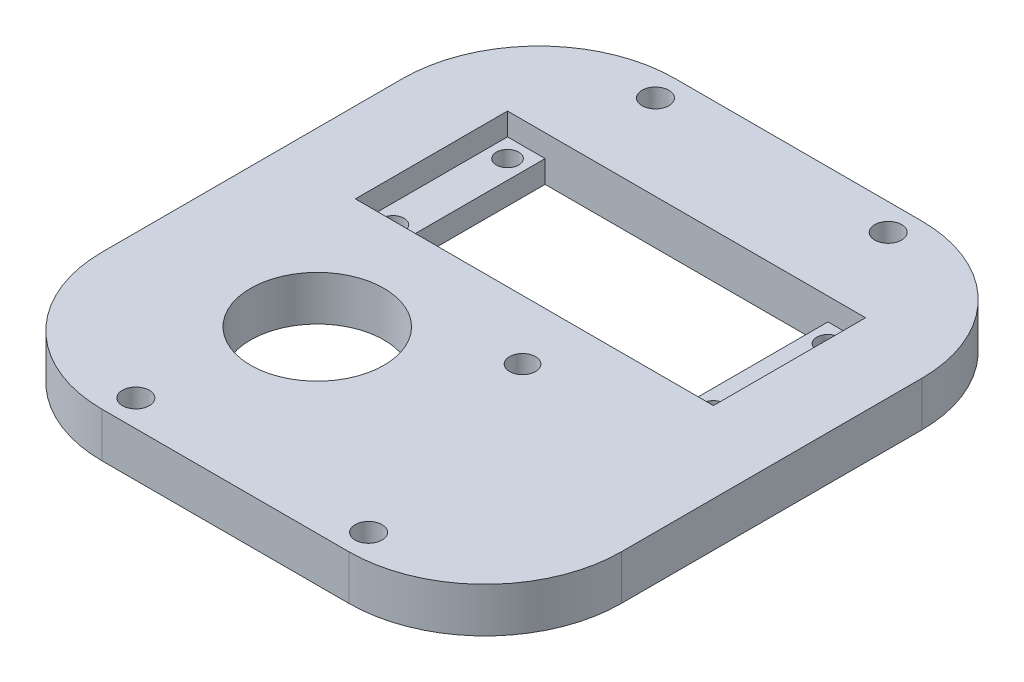
ISO-10303-21;
HEADER;
FILE_DESCRIPTION(('STEP AP214'),'2;1');
FILE_NAME('part.step','',(''),(''),'','','');
FILE_SCHEMA(('AUTOMOTIVE_DESIGN { 1 0 10303 214 1 1 1 1 }'));
ENDSEC;
DATA;
#1=APPLICATION_CONTEXT('core data for automotive mechanical design processes');
#2=APPLICATION_PROTOCOL_DEFINITION('international standard','automotive_design',2000,#1);
#3=PRODUCT_CONTEXT('',#1,'mechanical');
#4=PRODUCT('Part','Part','',(#3));
#5=PRODUCT_RELATED_PRODUCT_CATEGORY('part','',(#4));
#6=PRODUCT_DEFINITION_FORMATION('','',#4);
#7=PRODUCT_DEFINITION_CONTEXT('part definition',#1,'design');
#8=PRODUCT_DEFINITION('design','',#6,#7);
#9=PRODUCT_DEFINITION_SHAPE('','',#8);
#10=(LENGTH_UNIT() NAMED_UNIT(*) SI_UNIT(.MILLI.,.METRE.));
#11=(NAMED_UNIT(*) PLANE_ANGLE_UNIT() SI_UNIT($,.RADIAN.));
#12=(NAMED_UNIT(*) SI_UNIT($,.STERADIAN.) SOLID_ANGLE_UNIT());
#13=UNCERTAINTY_MEASURE_WITH_UNIT(LENGTH_MEASURE(1.E-05),#10,'distance_accuracy_value','');
#14=(GEOMETRIC_REPRESENTATION_CONTEXT(3) GLOBAL_UNCERTAINTY_ASSIGNED_CONTEXT((#13)) GLOBAL_UNIT_ASSIGNED_CONTEXT((#10,
#11,#12)) REPRESENTATION_CONTEXT('',''));
#15=CARTESIAN_POINT('',(0.,0.,0.));
#16=DIRECTION('',(0.,0.,1.));
#17=DIRECTION('',(1.,0.,0.));
#18=AXIS2_PLACEMENT_3D('',#15,#16,#17);
#19=CARTESIAN_POINT('',(0.,5.,0.));
#20=DIRECTION('',(0.,1.,0.));
#21=DIRECTION('',(0.,0.,1.));
#22=AXIS2_PLACEMENT_3D('',#19,#20,#21);
#23=PLANE('',#22);
#24=CARTESIAN_POINT('',(5.32323014813003,5.,16.1450680020259));
#25=DIRECTION('',(0.,1.,0.));
#26=DIRECTION('',(0.,0.,1.));
#27=AXIS2_PLACEMENT_3D('',#24,#25,#26);
#28=CIRCLE('',#27,1.45);
#29=CARTESIAN_POINT('',(5.32323014813003,5.,17.5950680020259));
#30=VERTEX_POINT('',#29);
#31=EDGE_CURVE('E239',#30,#30,#28,.T.);
#32=ORIENTED_EDGE('',*,*,#31,.F.);
#33=EDGE_LOOP('',(#32));
#34=FACE_BOUND('',#33,.T.);
#35=DIRECTION('',(1.,0.,0.));
#36=VECTOR('',#35,1.);
#37=CARTESIAN_POINT('',(0.,5.,44.));
#38=LINE('',#37,#36);
#39=CARTESIAN_POINT('',(-13.7775152864747,5.,44.));
#40=VERTEX_POINT('',#39);
#41=CARTESIAN_POINT('',(13.7775152864747,5.,44.));
#42=VERTEX_POINT('',#41);
#43=EDGE_CURVE('E217',#40,#42,#38,.T.);
#44=ORIENTED_EDGE('',*,*,#43,.T.);
#45=CARTESIAN_POINT('',(13.7775152864747,5.,28.7775152864747));
#46=DIRECTION('',(0.,1.,0.));
#47=DIRECTION('',(0.,0.,1.));
#48=AXIS2_PLACEMENT_3D('',#45,#46,#47);
#49=CIRCLE('',#48,15.2224847135253);
#50=CARTESIAN_POINT('',(29.,5.,28.7775152864747));
#51=VERTEX_POINT('',#50);
#52=EDGE_CURVE('E220',#42,#51,#49,.T.);
#53=ORIENTED_EDGE('',*,*,#52,.T.);
#54=DIRECTION('',(0.,0.,-1.));
#55=VECTOR('',#54,1.);
#56=CARTESIAN_POINT('',(29.,5.,0.));
#57=LINE('',#56,#55);
#58=CARTESIAN_POINT('',(29.,5.,-4.77751528647466));
#59=VERTEX_POINT('',#58);
#60=EDGE_CURVE('E223',#51,#59,#57,.T.);
#61=ORIENTED_EDGE('',*,*,#60,.T.);
#62=CARTESIAN_POINT('',(13.7775152864747,5.,-4.77751528647466));
#63=DIRECTION('',(0.,1.,0.));
#64=DIRECTION('',(0.,0.,1.));
#65=AXIS2_PLACEMENT_3D('',#62,#63,#64);
#66=CIRCLE('',#65,15.2224847135253);
#67=CARTESIAN_POINT('',(13.7775152864747,5.,-20.));
#68=VERTEX_POINT('',#67);
#69=EDGE_CURVE('E225',#68,#59,#66,.F.);
#70=ORIENTED_EDGE('',*,*,#69,.F.);
#71=DIRECTION('',(1.,0.,0.));
#72=VECTOR('',#71,1.);
#73=CARTESIAN_POINT('',(0.,5.,-20.));
#74=LINE('',#73,#72);
#75=CARTESIAN_POINT('',(-13.7775152864747,5.,-20.));
#76=VERTEX_POINT('',#75);
#77=EDGE_CURVE('E228',#76,#68,#74,.T.);
#78=ORIENTED_EDGE('',*,*,#77,.F.);
#79=CARTESIAN_POINT('',(-13.7775152864747,5.,-4.77751528647466));
#80=DIRECTION('',(0.,1.,0.));
#81=DIRECTION('',(0.,0.,1.));
#82=AXIS2_PLACEMENT_3D('',#79,#80,#81);
#83=CIRCLE('',#82,15.2224847135253);
#84=CARTESIAN_POINT('',(-29.,5.,-4.77751528647466));
#85=VERTEX_POINT('',#84);
#86=EDGE_CURVE('E231',#85,#76,#83,.F.);
#87=ORIENTED_EDGE('',*,*,#86,.F.);
#88=DIRECTION('',(0.,0.,-1.));
#89=VECTOR('',#88,1.);
#90=CARTESIAN_POINT('',(-29.,5.,0.));
#91=LINE('',#90,#89);
#92=CARTESIAN_POINT('',(-29.,5.,28.7775152864747));
#93=VERTEX_POINT('',#92);
#94=EDGE_CURVE('E234',#93,#85,#91,.T.);
#95=ORIENTED_EDGE('',*,*,#94,.F.);
#96=CARTESIAN_POINT('',(-13.7775152864747,5.,28.7775152864747));
#97=DIRECTION('',(0.,1.,0.));
#98=DIRECTION('',(0.,0.,1.));
#99=AXIS2_PLACEMENT_3D('',#96,#97,#98);
#100=CIRCLE('',#99,15.2224847135253);
#101=EDGE_CURVE('E237',#93,#40,#100,.T.);
#102=ORIENTED_EDGE('',*,*,#101,.T.);
#103=EDGE_LOOP('',(#44,#53,#61,#70,#78,#87,#95,#102));
#104=FACE_BOUND('',#103,.T.);
#105=CARTESIAN_POINT('',(13.,5.,-17.0248169859408));
#106=DIRECTION('',(0.,1.,0.));
#107=DIRECTION('',(0.,0.,1.));
#108=AXIS2_PLACEMENT_3D('',#105,#106,#107);
#109=CIRCLE('',#108,1.5);
#110=CARTESIAN_POINT('',(13.,5.,-15.5248169859408));
#111=VERTEX_POINT('',#110);
#112=EDGE_CURVE('E200',#111,#111,#109,.T.);
#113=ORIENTED_EDGE('',*,*,#112,.F.);
#114=EDGE_LOOP('',(#113));
#115=FACE_BOUND('',#114,.T.);
#116=CARTESIAN_POINT('',(-13.,5.,-17.0248169859408));
#117=DIRECTION('',(0.,1.,0.));
#118=DIRECTION('',(0.,0.,1.));
#119=AXIS2_PLACEMENT_3D('',#116,#117,#118);
#120=CIRCLE('',#119,1.5);
#121=CARTESIAN_POINT('',(-13.,5.,-15.5248169859408));
#122=VERTEX_POINT('',#121);
#123=EDGE_CURVE('E193',#122,#122,#120,.T.);
#124=ORIENTED_EDGE('',*,*,#123,.F.);
#125=EDGE_LOOP('',(#124));
#126=FACE_BOUND('',#125,.T.);
#127=CARTESIAN_POINT('',(-13.,5.,41.0248169859408));
#128=DIRECTION('',(0.,1.,0.));
#129=DIRECTION('',(0.,0.,-1.));
#130=AXIS2_PLACEMENT_3D('',#127,#128,#129);
#131=CIRCLE('',#130,1.5);
#132=CARTESIAN_POINT('',(-13.,5.,39.5248169859408));
#133=VERTEX_POINT('',#132);
#134=EDGE_CURVE('E201',#133,#133,#131,.T.);
#135=ORIENTED_EDGE('',*,*,#134,.F.);
#136=EDGE_LOOP('',(#135));
#137=FACE_BOUND('',#136,.T.);
#138=CARTESIAN_POINT('',(13.,5.,41.0248169859408));
#139=DIRECTION('',(0.,1.,0.));
#140=DIRECTION('',(0.,0.,-1.));
#141=AXIS2_PLACEMENT_3D('',#138,#139,#140);
#142=CIRCLE('',#141,1.5);
#143=CARTESIAN_POINT('',(13.,5.,39.5248169859408));
#144=VERTEX_POINT('',#143);
#145=EDGE_CURVE('E192',#144,#144,#142,.T.);
#146=ORIENTED_EDGE('',*,*,#145,.F.);
#147=EDGE_LOOP('',(#146));
#148=FACE_BOUND('',#147,.T.);
#149=CARTESIAN_POINT('',(-9.75324302390866,5.,24.));
#150=DIRECTION('',(0.,1.,0.));
#151=DIRECTION('',(0.,0.,1.));
#152=AXIS2_PLACEMENT_3D('',#149,#150,#151);
#153=CIRCLE('',#152,7.45);
#154=CARTESIAN_POINT('',(-9.75324302390866,5.,31.45));
#155=VERTEX_POINT('',#154);
#156=EDGE_CURVE('E188',#155,#155,#153,.T.);
#157=ORIENTED_EDGE('',*,*,#156,.F.);
#158=EDGE_LOOP('',(#157));
#159=FACE_BOUND('',#158,.T.);
#160=DIRECTION('',(0.,0.,-1.));
#161=VECTOR('',#160,1.);
#162=CARTESIAN_POINT('',(-20.,5.,0.));
#163=LINE('',#162,#161);
#164=CARTESIAN_POINT('',(-20.,5.,9.5));
#165=VERTEX_POINT('',#164);
#166=CARTESIAN_POINT('',(-20.,5.,-7.5));
#167=VERTEX_POINT('',#166);
#168=EDGE_CURVE('E161',#165,#167,#163,.T.);
#169=ORIENTED_EDGE('',*,*,#168,.T.);
#170=DIRECTION('',(1.,0.,0.));
#171=VECTOR('',#170,1.);
#172=CARTESIAN_POINT('',(0.,5.,-7.5));
#173=LINE('',#172,#171);
#174=CARTESIAN_POINT('',(20.,5.,-7.5));
#175=VERTEX_POINT('',#174);
#176=EDGE_CURVE('E641',#167,#175,#173,.T.);
#177=ORIENTED_EDGE('',*,*,#176,.T.);
#178=DIRECTION('',(0.,0.,-1.));
#179=VECTOR('',#178,1.);
#180=CARTESIAN_POINT('',(20.,5.,0.));
#181=LINE('',#180,#179);
#182=CARTESIAN_POINT('',(20.,5.,9.5));
#183=VERTEX_POINT('',#182);
#184=EDGE_CURVE('E628',#183,#175,#181,.T.);
#185=ORIENTED_EDGE('',*,*,#184,.F.);
#186=DIRECTION('',(1.,0.,0.));
#187=VECTOR('',#186,1.);
#188=CARTESIAN_POINT('',(0.,5.,9.5));
#189=LINE('',#188,#187);
#190=EDGE_CURVE('E179',#165,#183,#189,.T.);
#191=ORIENTED_EDGE('',*,*,#190,.F.);
#192=EDGE_LOOP('',(#169,#177,#185,#191));
#193=FACE_BOUND('',#192,.T.);
#194=ADVANCED_FACE('F36',(#34,#104,#115,#126,#137,#148,#159,#193),#23,.T.);
#195=CARTESIAN_POINT('',(-15.8,-35.8825863058949,0.));
#196=DIRECTION('',(1.,0.,0.));
#197=DIRECTION('',(0.,0.,-1.));
#198=AXIS2_PLACEMENT_3D('',#195,#196,#197);
#199=PLANE('',#198);
#200=DIRECTION('',(0.,1.,0.));
#201=VECTOR('',#200,1.);
#202=CARTESIAN_POINT('',(-15.8,-35.8825863058949,-7.5));
#203=LINE('',#202,#201);
#204=CARTESIAN_POINT('',(-15.8,0.,-7.5));
#205=VERTEX_POINT('',#204);
#206=CARTESIAN_POINT('',(-15.8,2.5,-7.5));
#207=VERTEX_POINT('',#206);
#208=EDGE_CURVE('E155',#205,#207,#203,.T.);
#209=ORIENTED_EDGE('',*,*,#208,.T.);
#210=DIRECTION('',(0.,0.,1.));
#211=VECTOR('',#210,1.);
#212=CARTESIAN_POINT('',(-15.8,2.5,0.));
#213=LINE('',#212,#211);
#214=CARTESIAN_POINT('',(-15.8,2.5,9.5));
#215=VERTEX_POINT('',#214);
#216=EDGE_CURVE('E164',#207,#215,#213,.T.);
#217=ORIENTED_EDGE('',*,*,#216,.T.);
#218=DIRECTION('',(0.,1.,0.));
#219=VECTOR('',#218,1.);
#220=CARTESIAN_POINT('',(-15.8,-35.8825863058949,9.5));
#221=LINE('',#220,#219);
#222=CARTESIAN_POINT('',(-15.8,0.,9.5));
#223=VERTEX_POINT('',#222);
#224=EDGE_CURVE('E175',#223,#215,#221,.T.);
#225=ORIENTED_EDGE('',*,*,#224,.F.);
#226=DIRECTION('',(0.,0.,1.));
#227=VECTOR('',#226,1.);
#228=CARTESIAN_POINT('',(-15.8,0.,0.));
#229=LINE('',#228,#227);
#230=EDGE_CURVE('E174',#205,#223,#229,.T.);
#231=ORIENTED_EDGE('',*,*,#230,.F.);
#232=EDGE_LOOP('',(#209,#217,#225,#231));
#233=FACE_BOUND('',#232,.T.);
#234=ADVANCED_FACE('F172',(#233),#199,.T.);
#235=CARTESIAN_POINT('',(15.8,-35.8825863058949,0.));
#236=DIRECTION('',(-1.,0.,0.));
#237=DIRECTION('',(0.,0.,1.));
#238=AXIS2_PLACEMENT_3D('',#235,#236,#237);
#239=PLANE('',#238);
#240=DIRECTION('',(0.,1.,0.));
#241=VECTOR('',#240,1.);
#242=CARTESIAN_POINT('',(15.8,-35.8825863058949,9.5));
#243=LINE('',#242,#241);
#244=CARTESIAN_POINT('',(15.8,0.,9.5));
#245=VERTEX_POINT('',#244);
#246=CARTESIAN_POINT('',(15.8,2.5,9.5));
#247=VERTEX_POINT('',#246);
#248=EDGE_CURVE('E177',#245,#247,#243,.T.);
#249=ORIENTED_EDGE('',*,*,#248,.T.);
#250=DIRECTION('',(0.,0.,1.));
#251=VECTOR('',#250,1.);
#252=CARTESIAN_POINT('',(15.8,2.5,0.));
#253=LINE('',#252,#251);
#254=CARTESIAN_POINT('',(15.8,2.5,-7.5));
#255=VERTEX_POINT('',#254);
#256=EDGE_CURVE('E620',#255,#247,#253,.T.);
#257=ORIENTED_EDGE('',*,*,#256,.F.);
#258=DIRECTION('',(0.,1.,0.));
#259=VECTOR('',#258,1.);
#260=CARTESIAN_POINT('',(15.8,-35.8825863058949,-7.5));
#261=LINE('',#260,#259);
#262=CARTESIAN_POINT('',(15.8,0.,-7.5));
#263=VERTEX_POINT('',#262);
#264=EDGE_CURVE('E58',#263,#255,#261,.T.);
#265=ORIENTED_EDGE('',*,*,#264,.F.);
#266=DIRECTION('',(0.,0.,-1.));
#267=VECTOR('',#266,1.);
#268=CARTESIAN_POINT('',(15.8,0.,0.));
#269=LINE('',#268,#267);
#270=EDGE_CURVE('E189',#245,#263,#269,.T.);
#271=ORIENTED_EDGE('',*,*,#270,.F.);
#272=EDGE_LOOP('',(#249,#257,#265,#271));
#273=FACE_BOUND('',#272,.T.);
#274=ADVANCED_FACE('F328',(#273),#239,.T.);
#275=CARTESIAN_POINT('',(17.9,-35.8825863058949,-5.4));
#276=DIRECTION('',(0.,1.,0.));
#277=DIRECTION('',(0.,0.,1.));
#278=AXIS2_PLACEMENT_3D('',#275,#276,#277);
#279=CYLINDRICAL_SURFACE('',#278,1.25);
#280=CARTESIAN_POINT('',(17.9,0.,-5.4));
#281=DIRECTION('',(0.,1.,0.));
#282=DIRECTION('',(0.,0.,1.));
#283=AXIS2_PLACEMENT_3D('',#280,#281,#282);
#284=CIRCLE('',#283,1.25);
#285=CARTESIAN_POINT('',(17.9,0.,-4.15));
#286=VERTEX_POINT('',#285);
#287=EDGE_CURVE('E638',#286,#286,#284,.T.);
#288=ORIENTED_EDGE('',*,*,#287,.F.);
#289=EDGE_LOOP('',(#288));
#290=FACE_BOUND('',#289,.T.);
#291=CARTESIAN_POINT('',(17.9,2.5,-5.4));
#292=DIRECTION('',(0.,1.,0.));
#293=DIRECTION('',(0.,0.,1.));
#294=AXIS2_PLACEMENT_3D('',#291,#292,#293);
#295=CIRCLE('',#294,1.25);
#296=CARTESIAN_POINT('',(17.9,2.5,-4.15));
#297=VERTEX_POINT('',#296);
#298=EDGE_CURVE('E619',#297,#297,#295,.T.);
#299=ORIENTED_EDGE('',*,*,#298,.T.);
#300=EDGE_LOOP('',(#299));
#301=FACE_BOUND('',#300,.T.);
#302=ADVANCED_FACE('F509',(#290,#301),#279,.F.);
#303=CARTESIAN_POINT('',(17.9,-35.8825863058949,7.4));
#304=DIRECTION('',(0.,1.,0.));
#305=DIRECTION('',(0.,0.,1.));
#306=AXIS2_PLACEMENT_3D('',#303,#304,#305);
#307=CYLINDRICAL_SURFACE('',#306,1.25);
#308=CARTESIAN_POINT('',(17.9,0.,7.4));
#309=DIRECTION('',(0.,1.,0.));
#310=DIRECTION('',(0.,0.,1.));
#311=AXIS2_PLACEMENT_3D('',#308,#309,#310);
#312=CIRCLE('',#311,1.25);
#313=CARTESIAN_POINT('',(17.9,0.,8.65));
#314=VERTEX_POINT('',#313);
#315=EDGE_CURVE('E642',#314,#314,#312,.F.);
#316=ORIENTED_EDGE('',*,*,#315,.T.);
#317=EDGE_LOOP('',(#316));
#318=FACE_BOUND('',#317,.T.);
#319=CARTESIAN_POINT('',(17.9,2.5,7.4));
#320=DIRECTION('',(0.,1.,0.));
#321=DIRECTION('',(0.,0.,1.));
#322=AXIS2_PLACEMENT_3D('',#319,#320,#321);
#323=CIRCLE('',#322,1.25);
#324=CARTESIAN_POINT('',(17.9,2.5,8.65));
#325=VERTEX_POINT('',#324);
#326=EDGE_CURVE('E614',#325,#325,#323,.F.);
#327=ORIENTED_EDGE('',*,*,#326,.F.);
#328=EDGE_LOOP('',(#327));
#329=FACE_BOUND('',#328,.T.);
#330=ADVANCED_FACE('F520',(#318,#329),#307,.F.);
#331=CARTESIAN_POINT('',(-17.9,-35.8825863058949,7.4));
#332=DIRECTION('',(0.,1.,0.));
#333=DIRECTION('',(0.,0.,1.));
#334=AXIS2_PLACEMENT_3D('',#331,#332,#333);
#335=CYLINDRICAL_SURFACE('',#334,1.25);
#336=CARTESIAN_POINT('',(-17.9,0.,7.4));
#337=DIRECTION('',(0.,1.,0.));
#338=DIRECTION('',(0.,0.,1.));
#339=AXIS2_PLACEMENT_3D('',#336,#337,#338);
#340=CIRCLE('',#339,1.25);
#341=CARTESIAN_POINT('',(-17.9,0.,8.65));
#342=VERTEX_POINT('',#341);
#343=EDGE_CURVE('E645',#342,#342,#340,.T.);
#344=ORIENTED_EDGE('',*,*,#343,.F.);
#345=EDGE_LOOP('',(#344));
#346=FACE_BOUND('',#345,.T.);
#347=CARTESIAN_POINT('',(-17.9,2.5,7.4));
#348=DIRECTION('',(0.,1.,0.));
#349=DIRECTION('',(0.,0.,1.));
#350=AXIS2_PLACEMENT_3D('',#347,#348,#349);
#351=CIRCLE('',#350,1.25);
#352=CARTESIAN_POINT('',(-17.9,2.5,8.65));
#353=VERTEX_POINT('',#352);
#354=EDGE_CURVE('E170',#353,#353,#351,.T.);
#355=ORIENTED_EDGE('',*,*,#354,.T.);
#356=EDGE_LOOP('',(#355));
#357=FACE_BOUND('',#356,.T.);
#358=ADVANCED_FACE('F531',(#346,#357),#335,.F.);
#359=CARTESIAN_POINT('',(-17.9,-35.8825863058949,-5.4));
#360=DIRECTION('',(0.,1.,0.));
#361=DIRECTION('',(0.,0.,1.));
#362=AXIS2_PLACEMENT_3D('',#359,#360,#361);
#363=CYLINDRICAL_SURFACE('',#362,1.25);
#364=CARTESIAN_POINT('',(-17.9,0.,-5.4));
#365=DIRECTION('',(0.,1.,0.));
#366=DIRECTION('',(0.,0.,1.));
#367=AXIS2_PLACEMENT_3D('',#364,#365,#366);
#368=CIRCLE('',#367,1.25);
#369=CARTESIAN_POINT('',(-17.9,0.,-4.15));
#370=VERTEX_POINT('',#369);
#371=EDGE_CURVE('E600',#370,#370,#368,.F.);
#372=ORIENTED_EDGE('',*,*,#371,.T.);
#373=EDGE_LOOP('',(#372));
#374=FACE_BOUND('',#373,.T.);
#375=CARTESIAN_POINT('',(-17.9,2.5,-5.4));
#376=DIRECTION('',(0.,1.,0.));
#377=DIRECTION('',(0.,0.,1.));
#378=AXIS2_PLACEMENT_3D('',#375,#376,#377);
#379=CIRCLE('',#378,1.25);
#380=CARTESIAN_POINT('',(-17.9,2.5,-4.15));
#381=VERTEX_POINT('',#380);
#382=EDGE_CURVE('E603',#381,#381,#379,.F.);
#383=ORIENTED_EDGE('',*,*,#382,.F.);
#384=EDGE_LOOP('',(#383));
#385=FACE_BOUND('',#384,.T.);
#386=ADVANCED_FACE('F337',(#374,#385),#363,.F.);
#387=CARTESIAN_POINT('',(0.,0.,0.));
#388=DIRECTION('',(0.,1.,0.));
#389=DIRECTION('',(0.,0.,1.));
#390=AXIS2_PLACEMENT_3D('',#387,#388,#389);
#391=PLANE('',#390);
#392=ORIENTED_EDGE('',*,*,#371,.F.);
#393=EDGE_LOOP('',(#392));
#394=FACE_BOUND('',#393,.T.);
#395=ORIENTED_EDGE('',*,*,#315,.F.);
#396=EDGE_LOOP('',(#395));
#397=FACE_BOUND('',#396,.T.);
#398=CARTESIAN_POINT('',(5.32323014813003,0.,16.1450680020259));
#399=DIRECTION('',(0.,1.,0.));
#400=DIRECTION('',(0.,0.,1.));
#401=AXIS2_PLACEMENT_3D('',#398,#399,#400);
#402=CIRCLE('',#401,1.45);
#403=CARTESIAN_POINT('',(5.32323014813003,0.,17.5950680020259));
#404=VERTEX_POINT('',#403);
#405=EDGE_CURVE('E221',#404,#404,#402,.T.);
#406=ORIENTED_EDGE('',*,*,#405,.T.);
#407=EDGE_LOOP('',(#406));
#408=FACE_BOUND('',#407,.T.);
#409=DIRECTION('',(1.,0.,0.));
#410=VECTOR('',#409,1.);
#411=CARTESIAN_POINT('',(0.,0.,44.));
#412=LINE('',#411,#410);
#413=CARTESIAN_POINT('',(-13.7775152864747,0.,44.));
#414=VERTEX_POINT('',#413);
#415=CARTESIAN_POINT('',(13.7775152864747,0.,44.));
#416=VERTEX_POINT('',#415);
#417=EDGE_CURVE('E216',#414,#416,#412,.T.);
#418=ORIENTED_EDGE('',*,*,#417,.F.);
#419=CARTESIAN_POINT('',(-13.7775152864747,0.,28.7775152864747));
#420=DIRECTION('',(0.,1.,0.));
#421=DIRECTION('',(0.,0.,1.));
#422=AXIS2_PLACEMENT_3D('',#419,#420,#421);
#423=CIRCLE('',#422,15.2224847135253);
#424=CARTESIAN_POINT('',(-29.,0.,28.7775152864747));
#425=VERTEX_POINT('',#424);
#426=EDGE_CURVE('E262',#425,#414,#423,.T.);
#427=ORIENTED_EDGE('',*,*,#426,.F.);
#428=DIRECTION('',(0.,0.,-1.));
#429=VECTOR('',#428,1.);
#430=CARTESIAN_POINT('',(-29.,0.,0.));
#431=LINE('',#430,#429);
#432=CARTESIAN_POINT('',(-29.,0.,-4.77751528647466));
#433=VERTEX_POINT('',#432);
#434=EDGE_CURVE('E259',#425,#433,#431,.T.);
#435=ORIENTED_EDGE('',*,*,#434,.T.);
#436=CARTESIAN_POINT('',(-13.7775152864747,0.,-4.77751528647466));
#437=DIRECTION('',(0.,1.,0.));
#438=DIRECTION('',(0.,0.,1.));
#439=AXIS2_PLACEMENT_3D('',#436,#437,#438);
#440=CIRCLE('',#439,15.2224847135253);
#441=CARTESIAN_POINT('',(-13.7775152864747,0.,-20.));
#442=VERTEX_POINT('',#441);
#443=EDGE_CURVE('E256',#433,#442,#440,.F.);
#444=ORIENTED_EDGE('',*,*,#443,.T.);
#445=DIRECTION('',(1.,0.,0.));
#446=VECTOR('',#445,1.);
#447=CARTESIAN_POINT('',(0.,0.,-20.));
#448=LINE('',#447,#446);
#449=CARTESIAN_POINT('',(13.7775152864747,0.,-20.));
#450=VERTEX_POINT('',#449);
#451=EDGE_CURVE('E253',#442,#450,#448,.T.);
#452=ORIENTED_EDGE('',*,*,#451,.T.);
#453=CARTESIAN_POINT('',(13.7775152864747,0.,-4.77751528647466));
#454=DIRECTION('',(0.,1.,0.));
#455=DIRECTION('',(0.,0.,1.));
#456=AXIS2_PLACEMENT_3D('',#453,#454,#455);
#457=CIRCLE('',#456,15.2224847135253);
#458=CARTESIAN_POINT('',(29.,0.,-4.77751528647466));
#459=VERTEX_POINT('',#458);
#460=EDGE_CURVE('E250',#450,#459,#457,.F.);
#461=ORIENTED_EDGE('',*,*,#460,.T.);
#462=DIRECTION('',(0.,0.,-1.));
#463=VECTOR('',#462,1.);
#464=CARTESIAN_POINT('',(29.,0.,0.));
#465=LINE('',#464,#463);
#466=CARTESIAN_POINT('',(29.,0.,28.7775152864747));
#467=VERTEX_POINT('',#466);
#468=EDGE_CURVE('E247',#467,#459,#465,.T.);
#469=ORIENTED_EDGE('',*,*,#468,.F.);
#470=CARTESIAN_POINT('',(13.7775152864747,0.,28.7775152864747));
#471=DIRECTION('',(0.,1.,0.));
#472=DIRECTION('',(0.,0.,1.));
#473=AXIS2_PLACEMENT_3D('',#470,#471,#472);
#474=CIRCLE('',#473,15.2224847135253);
#475=EDGE_CURVE('E245',#416,#467,#474,.T.);
#476=ORIENTED_EDGE('',*,*,#475,.F.);
#477=EDGE_LOOP('',(#418,#427,#435,#444,#452,#461,#469,#476));
#478=FACE_BOUND('',#477,.T.);
#479=CARTESIAN_POINT('',(13.,0.,-17.0248169859408));
#480=DIRECTION('',(0.,1.,0.));
#481=DIRECTION('',(0.,0.,1.));
#482=AXIS2_PLACEMENT_3D('',#479,#480,#481);
#483=CIRCLE('',#482,1.5);
#484=CARTESIAN_POINT('',(13.,0.,-15.5248169859408));
#485=VERTEX_POINT('',#484);
#486=EDGE_CURVE('E213',#485,#485,#483,.F.);
#487=ORIENTED_EDGE('',*,*,#486,.F.);
#488=EDGE_LOOP('',(#487));
#489=FACE_BOUND('',#488,.T.);
#490=CARTESIAN_POINT('',(-13.,0.,-17.0248169859408));
#491=DIRECTION('',(0.,1.,0.));
#492=DIRECTION('',(0.,0.,1.));
#493=AXIS2_PLACEMENT_3D('',#490,#491,#492);
#494=CIRCLE('',#493,1.5);
#495=CARTESIAN_POINT('',(-13.,0.,-15.5248169859408));
#496=VERTEX_POINT('',#495);
#497=EDGE_CURVE('E196',#496,#496,#494,.F.);
#498=ORIENTED_EDGE('',*,*,#497,.F.);
#499=EDGE_LOOP('',(#498));
#500=FACE_BOUND('',#499,.T.);
#501=CARTESIAN_POINT('',(-13.,0.,41.0248169859408));
#502=DIRECTION('',(0.,1.,0.));
#503=DIRECTION('',(0.,0.,1.));
#504=AXIS2_PLACEMENT_3D('',#501,#502,#503);
#505=CIRCLE('',#504,1.5);
#506=CARTESIAN_POINT('',(-13.,0.,42.5248169859408));
#507=VERTEX_POINT('',#506);
#508=EDGE_CURVE('E197',#507,#507,#505,.F.);
#509=ORIENTED_EDGE('',*,*,#508,.F.);
#510=EDGE_LOOP('',(#509));
#511=FACE_BOUND('',#510,.T.);
#512=CARTESIAN_POINT('',(13.,0.,41.0248169859408));
#513=DIRECTION('',(0.,1.,0.));
#514=DIRECTION('',(0.,0.,1.));
#515=AXIS2_PLACEMENT_3D('',#512,#513,#514);
#516=CIRCLE('',#515,1.5);
#517=CARTESIAN_POINT('',(13.,0.,42.5248169859408));
#518=VERTEX_POINT('',#517);
#519=EDGE_CURVE('E204',#518,#518,#516,.F.);
#520=ORIENTED_EDGE('',*,*,#519,.F.);
#521=EDGE_LOOP('',(#520));
#522=FACE_BOUND('',#521,.T.);
#523=CARTESIAN_POINT('',(-9.75324302390866,0.,24.));
#524=DIRECTION('',(0.,1.,0.));
#525=DIRECTION('',(0.,0.,1.));
#526=AXIS2_PLACEMENT_3D('',#523,#524,#525);
#527=CIRCLE('',#526,7.45);
#528=CARTESIAN_POINT('',(-9.75324302390866,0.,31.45));
#529=VERTEX_POINT('',#528);
#530=EDGE_CURVE('E185',#529,#529,#527,.T.);
#531=ORIENTED_EDGE('',*,*,#530,.T.);
#532=EDGE_LOOP('',(#531));
#533=FACE_BOUND('',#532,.T.);
#534=DIRECTION('',(-1.,0.,0.));
#535=VECTOR('',#534,1.);
#536=CARTESIAN_POINT('',(0.,0.,-7.5));
#537=LINE('',#536,#535);
#538=EDGE_CURVE('E183',#263,#205,#537,.T.);
#539=ORIENTED_EDGE('',*,*,#538,.T.);
#540=ORIENTED_EDGE('',*,*,#230,.T.);
#541=DIRECTION('',(-1.,0.,0.));
#542=VECTOR('',#541,1.);
#543=CARTESIAN_POINT('',(0.,0.,9.5));
#544=LINE('',#543,#542);
#545=EDGE_CURVE('E650',#245,#223,#544,.T.);
#546=ORIENTED_EDGE('',*,*,#545,.F.);
#547=ORIENTED_EDGE('',*,*,#270,.T.);
#548=EDGE_LOOP('',(#539,#540,#546,#547));
#549=FACE_BOUND('',#548,.T.);
#550=ORIENTED_EDGE('',*,*,#287,.T.);
#551=EDGE_LOOP('',(#550));
#552=FACE_BOUND('',#551,.T.);
#553=ORIENTED_EDGE('',*,*,#343,.T.);
#554=EDGE_LOOP('',(#553));
#555=FACE_BOUND('',#554,.T.);
#556=ADVANCED_FACE('F287',(#394,#397,#408,#478,#489,#500,#511,#522,#533,#549,#552,#555),#391,.F.);
#557=CARTESIAN_POINT('',(0.,5.,44.));
#558=DIRECTION('',(0.,0.,-1.));
#559=DIRECTION('',(-1.,0.,0.));
#560=AXIS2_PLACEMENT_3D('',#557,#558,#559);
#561=PLANE('',#560);
#562=ORIENTED_EDGE('',*,*,#417,.T.);
#563=DIRECTION('',(0.,-1.,0.));
#564=VECTOR('',#563,1.);
#565=CARTESIAN_POINT('',(13.7775152864747,5.,44.));
#566=LINE('',#565,#564);
#567=EDGE_CURVE('E12',#42,#416,#566,.T.);
#568=ORIENTED_EDGE('',*,*,#567,.F.);
#569=ORIENTED_EDGE('',*,*,#43,.F.);
#570=DIRECTION('',(0.,-1.,0.));
#571=VECTOR('',#570,1.);
#572=CARTESIAN_POINT('',(-13.7775152864747,5.,44.));
#573=LINE('',#572,#571);
#574=EDGE_CURVE('E242',#40,#414,#573,.T.);
#575=ORIENTED_EDGE('',*,*,#574,.T.);
#576=EDGE_LOOP('',(#562,#568,#569,#575));
#577=FACE_BOUND('',#576,.T.);
#578=ADVANCED_FACE('F38',(#577),#561,.F.);
#579=CARTESIAN_POINT('',(13.7775152864747,5.,28.7775152864747));
#580=DIRECTION('',(0.,-1.,0.));
#581=DIRECTION('',(0.,0.,-1.));
#582=AXIS2_PLACEMENT_3D('',#579,#580,#581);
#583=CYLINDRICAL_SURFACE('',#582,15.2224847135253);
#584=ORIENTED_EDGE('',*,*,#475,.T.);
#585=DIRECTION('',(0.,-1.,0.));
#586=VECTOR('',#585,1.);
#587=CARTESIAN_POINT('',(29.,5.,28.7775152864747));
#588=LINE('',#587,#586);
#589=EDGE_CURVE('E44',#51,#467,#588,.T.);
#590=ORIENTED_EDGE('',*,*,#589,.F.);
#591=ORIENTED_EDGE('',*,*,#52,.F.);
#592=ORIENTED_EDGE('',*,*,#567,.T.);
#593=EDGE_LOOP('',(#584,#590,#591,#592));
#594=FACE_BOUND('',#593,.T.);
#595=ADVANCED_FACE('F315',(#594),#583,.T.);
#596=CARTESIAN_POINT('',(29.,5.,0.));
#597=DIRECTION('',(-1.,0.,0.));
#598=DIRECTION('',(0.,0.,1.));
#599=AXIS2_PLACEMENT_3D('',#596,#597,#598);
#600=PLANE('',#599);
#601=ORIENTED_EDGE('',*,*,#468,.T.);
#602=DIRECTION('',(0.,-1.,0.));
#603=VECTOR('',#602,1.);
#604=CARTESIAN_POINT('',(29.,5.,-4.77751528647466));
#605=LINE('',#604,#603);
#606=EDGE_CURVE('E276',#59,#459,#605,.T.);
#607=ORIENTED_EDGE('',*,*,#606,.F.);
#608=ORIENTED_EDGE('',*,*,#60,.F.);
#609=ORIENTED_EDGE('',*,*,#589,.T.);
#610=EDGE_LOOP('',(#601,#607,#608,#609));
#611=FACE_BOUND('',#610,.T.);
#612=ADVANCED_FACE('F282',(#611),#600,.F.);
#613=CARTESIAN_POINT('',(13.7775152864747,5.,-4.77751528647466));
#614=DIRECTION('',(0.,-1.,0.));
#615=DIRECTION('',(0.,0.,-1.));
#616=AXIS2_PLACEMENT_3D('',#613,#614,#615);
#617=CYLINDRICAL_SURFACE('',#616,15.2224847135253);
#618=ORIENTED_EDGE('',*,*,#460,.F.);
#619=DIRECTION('',(0.,-1.,0.));
#620=VECTOR('',#619,1.);
#621=CARTESIAN_POINT('',(13.7775152864747,5.,-20.));
#622=LINE('',#621,#620);
#623=EDGE_CURVE('E274',#68,#450,#622,.T.);
#624=ORIENTED_EDGE('',*,*,#623,.F.);
#625=ORIENTED_EDGE('',*,*,#69,.T.);
#626=ORIENTED_EDGE('',*,*,#606,.T.);
#627=EDGE_LOOP('',(#618,#624,#625,#626));
#628=FACE_BOUND('',#627,.T.);
#629=ADVANCED_FACE('F292',(#628),#617,.T.);
#630=CARTESIAN_POINT('',(0.,5.,-20.));
#631=DIRECTION('',(0.,0.,-1.));
#632=DIRECTION('',(-1.,0.,0.));
#633=AXIS2_PLACEMENT_3D('',#630,#631,#632);
#634=PLANE('',#633);
#635=ORIENTED_EDGE('',*,*,#451,.F.);
#636=DIRECTION('',(0.,-1.,0.));
#637=VECTOR('',#636,1.);
#638=CARTESIAN_POINT('',(-13.7775152864747,5.,-20.));
#639=LINE('',#638,#637);
#640=EDGE_CURVE('E272',#76,#442,#639,.T.);
#641=ORIENTED_EDGE('',*,*,#640,.F.);
#642=ORIENTED_EDGE('',*,*,#77,.T.);
#643=ORIENTED_EDGE('',*,*,#623,.T.);
#644=EDGE_LOOP('',(#635,#641,#642,#643));
#645=FACE_BOUND('',#644,.T.);
#646=ADVANCED_FACE('F299',(#645),#634,.T.);
#647=CARTESIAN_POINT('',(-13.7775152864747,5.,-4.77751528647466));
#648=DIRECTION('',(0.,-1.,0.));
#649=DIRECTION('',(0.,0.,-1.));
#650=AXIS2_PLACEMENT_3D('',#647,#648,#649);
#651=CYLINDRICAL_SURFACE('',#650,15.2224847135253);
#652=ORIENTED_EDGE('',*,*,#443,.F.);
#653=DIRECTION('',(0.,-1.,0.));
#654=VECTOR('',#653,1.);
#655=CARTESIAN_POINT('',(-29.,5.,-4.77751528647466));
#656=LINE('',#655,#654);
#657=EDGE_CURVE('E270',#85,#433,#656,.T.);
#658=ORIENTED_EDGE('',*,*,#657,.F.);
#659=ORIENTED_EDGE('',*,*,#86,.T.);
#660=ORIENTED_EDGE('',*,*,#640,.T.);
#661=EDGE_LOOP('',(#652,#658,#659,#660));
#662=FACE_BOUND('',#661,.T.);
#663=ADVANCED_FACE('F302',(#662),#651,.T.);
#664=CARTESIAN_POINT('',(-29.,5.,0.));
#665=DIRECTION('',(-1.,0.,0.));
#666=DIRECTION('',(0.,0.,1.));
#667=AXIS2_PLACEMENT_3D('',#664,#665,#666);
#668=PLANE('',#667);
#669=ORIENTED_EDGE('',*,*,#434,.F.);
#670=DIRECTION('',(0.,-1.,0.));
#671=VECTOR('',#670,1.);
#672=CARTESIAN_POINT('',(-29.,5.,28.7775152864747));
#673=LINE('',#672,#671);
#674=EDGE_CURVE('E268',#93,#425,#673,.T.);
#675=ORIENTED_EDGE('',*,*,#674,.F.);
#676=ORIENTED_EDGE('',*,*,#94,.T.);
#677=ORIENTED_EDGE('',*,*,#657,.T.);
#678=EDGE_LOOP('',(#669,#675,#676,#677));
#679=FACE_BOUND('',#678,.T.);
#680=ADVANCED_FACE('F306',(#679),#668,.T.);
#681=CARTESIAN_POINT('',(5.32323014813003,5.,16.1450680020259));
#682=DIRECTION('',(0.,-1.,0.));
#683=DIRECTION('',(0.,0.,-1.));
#684=AXIS2_PLACEMENT_3D('',#681,#682,#683);
#685=CYLINDRICAL_SURFACE('',#684,1.45);
#686=ORIENTED_EDGE('',*,*,#31,.T.);
#687=EDGE_LOOP('',(#686));
#688=FACE_BOUND('',#687,.T.);
#689=ORIENTED_EDGE('',*,*,#405,.F.);
#690=EDGE_LOOP('',(#689));
#691=FACE_BOUND('',#690,.T.);
#692=ADVANCED_FACE('F339',(#688,#691),#685,.F.);
#693=CARTESIAN_POINT('',(-13.7775152864747,5.,28.7775152864747));
#694=DIRECTION('',(0.,-1.,0.));
#695=DIRECTION('',(0.,0.,-1.));
#696=AXIS2_PLACEMENT_3D('',#693,#694,#695);
#697=CYLINDRICAL_SURFACE('',#696,15.2224847135253);
#698=ORIENTED_EDGE('',*,*,#426,.T.);
#699=ORIENTED_EDGE('',*,*,#574,.F.);
#700=ORIENTED_EDGE('',*,*,#101,.F.);
#701=ORIENTED_EDGE('',*,*,#674,.T.);
#702=EDGE_LOOP('',(#698,#699,#700,#701));
#703=FACE_BOUND('',#702,.T.);
#704=ADVANCED_FACE('F311',(#703),#697,.T.);
#705=CARTESIAN_POINT('',(13.,-4.24264068711929,-17.0248169859408));
#706=DIRECTION('',(0.,1.,0.));
#707=DIRECTION('',(0.,0.,1.));
#708=AXIS2_PLACEMENT_3D('',#705,#706,#707);
#709=CYLINDRICAL_SURFACE('',#708,1.5);
#710=ORIENTED_EDGE('',*,*,#486,.T.);
#711=EDGE_LOOP('',(#710));
#712=FACE_BOUND('',#711,.T.);
#713=ORIENTED_EDGE('',*,*,#112,.T.);
#714=EDGE_LOOP('',(#713));
#715=FACE_BOUND('',#714,.T.);
#716=ADVANCED_FACE('F333',(#712,#715),#709,.F.);
#717=CARTESIAN_POINT('',(-13.,-4.24264068711929,-17.0248169859408));
#718=DIRECTION('',(0.,1.,0.));
#719=DIRECTION('',(0.,0.,1.));
#720=AXIS2_PLACEMENT_3D('',#717,#718,#719);
#721=CYLINDRICAL_SURFACE('',#720,1.5);
#722=ORIENTED_EDGE('',*,*,#497,.T.);
#723=EDGE_LOOP('',(#722));
#724=FACE_BOUND('',#723,.T.);
#725=ORIENTED_EDGE('',*,*,#123,.T.);
#726=EDGE_LOOP('',(#725));
#727=FACE_BOUND('',#726,.T.);
#728=ADVANCED_FACE('F382',(#724,#727),#721,.F.);
#729=CARTESIAN_POINT('',(-13.,-4.24264068711929,41.0248169859408));
#730=DIRECTION('',(0.,1.,0.));
#731=DIRECTION('',(0.,0.,1.));
#732=AXIS2_PLACEMENT_3D('',#729,#730,#731);
#733=CYLINDRICAL_SURFACE('',#732,1.5);
#734=ORIENTED_EDGE('',*,*,#508,.T.);
#735=EDGE_LOOP('',(#734));
#736=FACE_BOUND('',#735,.T.);
#737=ORIENTED_EDGE('',*,*,#134,.T.);
#738=EDGE_LOOP('',(#737));
#739=FACE_BOUND('',#738,.T.);
#740=ADVANCED_FACE('F389',(#736,#739),#733,.F.);
#741=CARTESIAN_POINT('',(13.,-4.24264068711929,41.0248169859408));
#742=DIRECTION('',(0.,1.,0.));
#743=DIRECTION('',(0.,0.,1.));
#744=AXIS2_PLACEMENT_3D('',#741,#742,#743);
#745=CYLINDRICAL_SURFACE('',#744,1.5);
#746=ORIENTED_EDGE('',*,*,#519,.T.);
#747=EDGE_LOOP('',(#746));
#748=FACE_BOUND('',#747,.T.);
#749=ORIENTED_EDGE('',*,*,#145,.T.);
#750=EDGE_LOOP('',(#749));
#751=FACE_BOUND('',#750,.T.);
#752=ADVANCED_FACE('F397',(#748,#751),#745,.F.);
#753=CARTESIAN_POINT('',(-9.75324302390866,26.0717820793591,24.));
#754=DIRECTION('',(0.,-1.,0.));
#755=DIRECTION('',(0.,0.,-1.));
#756=AXIS2_PLACEMENT_3D('',#753,#754,#755);
#757=CYLINDRICAL_SURFACE('',#756,7.45);
#758=ORIENTED_EDGE('',*,*,#530,.F.);
#759=EDGE_LOOP('',(#758));
#760=FACE_BOUND('',#759,.T.);
#761=ORIENTED_EDGE('',*,*,#156,.T.);
#762=EDGE_LOOP('',(#761));
#763=FACE_BOUND('',#762,.T.);
#764=ADVANCED_FACE('F405',(#760,#763),#757,.F.);
#765=CARTESIAN_POINT('',(0.,-35.8825863058949,-7.5));
#766=DIRECTION('',(0.,0.,1.));
#767=DIRECTION('',(1.,0.,0.));
#768=AXIS2_PLACEMENT_3D('',#765,#766,#767);
#769=PLANE('',#768);
#770=ORIENTED_EDGE('',*,*,#264,.T.);
#771=DIRECTION('',(-1.,0.,0.));
#772=VECTOR('',#771,1.);
#773=CARTESIAN_POINT('',(0.,2.5,-7.5));
#774=LINE('',#773,#772);
#775=CARTESIAN_POINT('',(20.,2.5,-7.5));
#776=VERTEX_POINT('',#775);
#777=EDGE_CURVE('E51',#776,#255,#774,.T.);
#778=ORIENTED_EDGE('',*,*,#777,.F.);
#779=DIRECTION('',(0.,1.,0.));
#780=VECTOR('',#779,1.);
#781=CARTESIAN_POINT('',(20.,-17.511139311878,-7.5));
#782=LINE('',#781,#780);
#783=EDGE_CURVE('E623',#776,#175,#782,.T.);
#784=ORIENTED_EDGE('',*,*,#783,.T.);
#785=ORIENTED_EDGE('',*,*,#176,.F.);
#786=DIRECTION('',(0.,1.,0.));
#787=VECTOR('',#786,1.);
#788=CARTESIAN_POINT('',(-20.,-17.511139311878,-7.5));
#789=LINE('',#788,#787);
#790=CARTESIAN_POINT('',(-20.,2.5,-7.5));
#791=VERTEX_POINT('',#790);
#792=EDGE_CURVE('E158',#791,#167,#789,.T.);
#793=ORIENTED_EDGE('',*,*,#792,.F.);
#794=DIRECTION('',(-1.,0.,0.));
#795=VECTOR('',#794,1.);
#796=CARTESIAN_POINT('',(0.,2.5,-7.5));
#797=LINE('',#796,#795);
#798=EDGE_CURVE('E151',#207,#791,#797,.T.);
#799=ORIENTED_EDGE('',*,*,#798,.F.);
#800=ORIENTED_EDGE('',*,*,#208,.F.);
#801=ORIENTED_EDGE('',*,*,#538,.F.);
#802=EDGE_LOOP('',(#770,#778,#784,#785,#793,#799,#800,#801));
#803=FACE_BOUND('',#802,.T.);
#804=ADVANCED_FACE('F153',(#803),#769,.T.);
#805=CARTESIAN_POINT('',(0.,-35.8825863058949,9.5));
#806=DIRECTION('',(0.,0.,1.));
#807=DIRECTION('',(1.,0.,0.));
#808=AXIS2_PLACEMENT_3D('',#805,#806,#807);
#809=PLANE('',#808);
#810=ORIENTED_EDGE('',*,*,#545,.T.);
#811=ORIENTED_EDGE('',*,*,#224,.T.);
#812=DIRECTION('',(-1.,0.,0.));
#813=VECTOR('',#812,1.);
#814=CARTESIAN_POINT('',(0.,2.5,9.5));
#815=LINE('',#814,#813);
#816=CARTESIAN_POINT('',(-20.,2.5,9.5));
#817=VERTEX_POINT('',#816);
#818=EDGE_CURVE('E166',#215,#817,#815,.T.);
#819=ORIENTED_EDGE('',*,*,#818,.T.);
#820=DIRECTION('',(0.,1.,0.));
#821=VECTOR('',#820,1.);
#822=CARTESIAN_POINT('',(-20.,-17.511139311878,9.5));
#823=LINE('',#822,#821);
#824=EDGE_CURVE('E610',#817,#165,#823,.T.);
#825=ORIENTED_EDGE('',*,*,#824,.T.);
#826=ORIENTED_EDGE('',*,*,#190,.T.);
#827=DIRECTION('',(0.,1.,0.));
#828=VECTOR('',#827,1.);
#829=CARTESIAN_POINT('',(20.,-17.511139311878,9.5));
#830=LINE('',#829,#828);
#831=CARTESIAN_POINT('',(20.,2.5,9.5));
#832=VERTEX_POINT('',#831);
#833=EDGE_CURVE('E631',#832,#183,#830,.T.);
#834=ORIENTED_EDGE('',*,*,#833,.F.);
#835=DIRECTION('',(-1.,0.,0.));
#836=VECTOR('',#835,1.);
#837=CARTESIAN_POINT('',(0.,2.5,9.5));
#838=LINE('',#837,#836);
#839=EDGE_CURVE('E617',#832,#247,#838,.T.);
#840=ORIENTED_EDGE('',*,*,#839,.T.);
#841=ORIENTED_EDGE('',*,*,#248,.F.);
#842=EDGE_LOOP('',(#810,#811,#819,#825,#826,#834,#840,#841));
#843=FACE_BOUND('',#842,.T.);
#844=ADVANCED_FACE('F420',(#843),#809,.F.);
#845=CARTESIAN_POINT('',(-20.,-17.511139311878,0.));
#846=DIRECTION('',(1.,0.,0.));
#847=DIRECTION('',(0.,0.,-1.));
#848=AXIS2_PLACEMENT_3D('',#845,#846,#847);
#849=PLANE('',#848);
#850=ORIENTED_EDGE('',*,*,#792,.T.);
#851=ORIENTED_EDGE('',*,*,#168,.F.);
#852=ORIENTED_EDGE('',*,*,#824,.F.);
#853=DIRECTION('',(0.,0.,1.));
#854=VECTOR('',#853,1.);
#855=CARTESIAN_POINT('',(-20.,2.5,0.));
#856=LINE('',#855,#854);
#857=EDGE_CURVE('E613',#791,#817,#856,.T.);
#858=ORIENTED_EDGE('',*,*,#857,.F.);
#859=EDGE_LOOP('',(#850,#851,#852,#858));
#860=FACE_BOUND('',#859,.T.);
#861=ADVANCED_FACE('F428',(#860),#849,.T.);
#862=CARTESIAN_POINT('',(0.,2.5,0.));
#863=DIRECTION('',(0.,1.,0.));
#864=DIRECTION('',(0.,0.,1.));
#865=AXIS2_PLACEMENT_3D('',#862,#863,#864);
#866=PLANE('',#865);
#867=ORIENTED_EDGE('',*,*,#382,.T.);
#868=EDGE_LOOP('',(#867));
#869=FACE_BOUND('',#868,.T.);
#870=ORIENTED_EDGE('',*,*,#354,.F.);
#871=EDGE_LOOP('',(#870));
#872=FACE_BOUND('',#871,.T.);
#873=ORIENTED_EDGE('',*,*,#798,.T.);
#874=ORIENTED_EDGE('',*,*,#857,.T.);
#875=ORIENTED_EDGE('',*,*,#818,.F.);
#876=ORIENTED_EDGE('',*,*,#216,.F.);
#877=EDGE_LOOP('',(#873,#874,#875,#876));
#878=FACE_BOUND('',#877,.T.);
#879=ADVANCED_FACE('F165',(#869,#872,#878),#866,.T.);
#880=CARTESIAN_POINT('',(20.,-17.511139311878,0.));
#881=DIRECTION('',(1.,0.,0.));
#882=DIRECTION('',(0.,0.,-1.));
#883=AXIS2_PLACEMENT_3D('',#880,#881,#882);
#884=PLANE('',#883);
#885=DIRECTION('',(0.,0.,1.));
#886=VECTOR('',#885,1.);
#887=CARTESIAN_POINT('',(20.,2.5,0.));
#888=LINE('',#887,#886);
#889=EDGE_CURVE('E621',#776,#832,#888,.T.);
#890=ORIENTED_EDGE('',*,*,#889,.T.);
#891=ORIENTED_EDGE('',*,*,#833,.T.);
#892=ORIENTED_EDGE('',*,*,#184,.T.);
#893=ORIENTED_EDGE('',*,*,#783,.F.);
#894=EDGE_LOOP('',(#890,#891,#892,#893));
#895=FACE_BOUND('',#894,.T.);
#896=ADVANCED_FACE('F443',(#895),#884,.F.);
#897=CARTESIAN_POINT('',(0.,2.5,0.));
#898=DIRECTION('',(0.,1.,0.));
#899=DIRECTION('',(0.,0.,1.));
#900=AXIS2_PLACEMENT_3D('',#897,#898,#899);
#901=PLANE('',#900);
#902=ORIENTED_EDGE('',*,*,#298,.F.);
#903=EDGE_LOOP('',(#902));
#904=FACE_BOUND('',#903,.T.);
#905=ORIENTED_EDGE('',*,*,#326,.T.);
#906=EDGE_LOOP('',(#905));
#907=FACE_BOUND('',#906,.T.);
#908=ORIENTED_EDGE('',*,*,#777,.T.);
#909=ORIENTED_EDGE('',*,*,#256,.T.);
#910=ORIENTED_EDGE('',*,*,#839,.F.);
#911=ORIENTED_EDGE('',*,*,#889,.F.);
#912=EDGE_LOOP('',(#908,#909,#910,#911));
#913=FACE_BOUND('',#912,.T.);
#914=ADVANCED_FACE('F451',(#904,#907,#913),#901,.T.);
#915=CLOSED_SHELL('',(#194,#234,#274,#302,#330,#358,#386,#556,#578,#595,#612,#629,#646,#663,
#680,#692,#704,#716,#728,#740,#752,#764,#804,#844,#861,#879,#896,#914));
#916=MANIFOLD_SOLID_BREP('B2',#915);
#917=ADVANCED_BREP_SHAPE_REPRESENTATION('',(#18,#916),#14);
#918=SHAPE_DEFINITION_REPRESENTATION(#9,#917);
ENDSEC;
END-ISO-10303-21;
